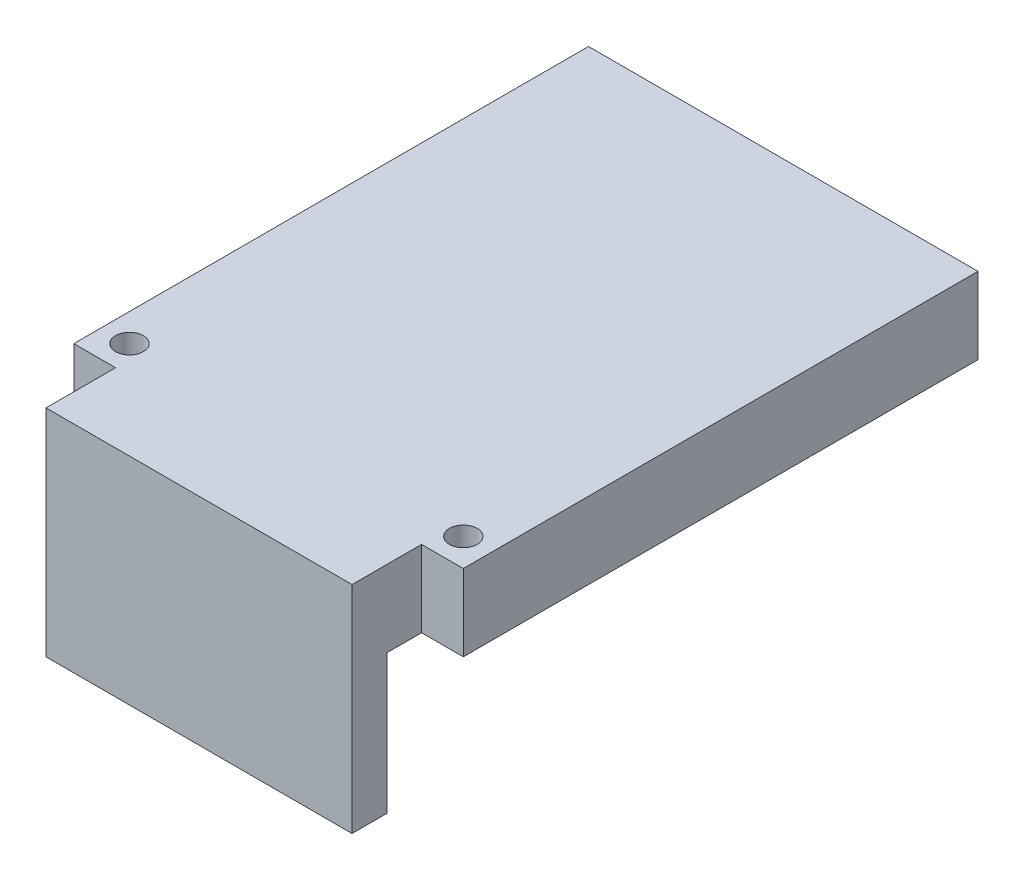
ISO-10303-21;
HEADER;
FILE_DESCRIPTION(('STEP AP214'),'2;1');
FILE_NAME('part.step','',(''),(''),'','','');
FILE_SCHEMA(('AUTOMOTIVE_DESIGN { 1 0 10303 214 1 1 1 1 }'));
ENDSEC;
DATA;
#1=APPLICATION_CONTEXT('core data for automotive mechanical design processes');
#2=APPLICATION_PROTOCOL_DEFINITION('international standard','automotive_design',2000,#1);
#3=PRODUCT_CONTEXT('',#1,'mechanical');
#4=PRODUCT('Part','Part','',(#3));
#5=PRODUCT_RELATED_PRODUCT_CATEGORY('part','',(#4));
#6=PRODUCT_DEFINITION_FORMATION('','',#4);
#7=PRODUCT_DEFINITION_CONTEXT('part definition',#1,'design');
#8=PRODUCT_DEFINITION('design','',#6,#7);
#9=PRODUCT_DEFINITION_SHAPE('','',#8);
#10=(LENGTH_UNIT() NAMED_UNIT(*) SI_UNIT(.MILLI.,.METRE.));
#11=(NAMED_UNIT(*) PLANE_ANGLE_UNIT() SI_UNIT($,.RADIAN.));
#12=(NAMED_UNIT(*) SI_UNIT($,.STERADIAN.) SOLID_ANGLE_UNIT());
#13=UNCERTAINTY_MEASURE_WITH_UNIT(LENGTH_MEASURE(1.E-05),#10,'distance_accuracy_value','');
#14=(GEOMETRIC_REPRESENTATION_CONTEXT(3) GLOBAL_UNCERTAINTY_ASSIGNED_CONTEXT((#13)) GLOBAL_UNIT_ASSIGNED_CONTEXT((#10,
#11,#12)) REPRESENTATION_CONTEXT('',''));
#15=CARTESIAN_POINT('',(0.,0.,0.));
#16=DIRECTION('',(0.,0.,1.));
#17=DIRECTION('',(1.,0.,0.));
#18=AXIS2_PLACEMENT_3D('',#15,#16,#17);
#19=CARTESIAN_POINT('',(0.,5.5,0.));
#20=DIRECTION('',(1.,0.,0.));
#21=DIRECTION('',(0.,0.,-1.));
#22=AXIS2_PLACEMENT_3D('',#19,#20,#21);
#23=PLANE('',#22);
#24=DIRECTION('',(0.,0.,1.));
#25=VECTOR('',#24,1.);
#26=CARTESIAN_POINT('',(0.,0.,0.));
#27=LINE('',#26,#25);
#28=CARTESIAN_POINT('',(0.,0.,-42.));
#29=VERTEX_POINT('',#28);
#30=CARTESIAN_POINT('',(0.,0.,-5.));
#31=VERTEX_POINT('',#30);
#32=EDGE_CURVE('E158',#29,#31,#27,.T.);
#33=ORIENTED_EDGE('',*,*,#32,.T.);
#34=DIRECTION('',(0.,1.,0.));
#35=VECTOR('',#34,1.);
#36=CARTESIAN_POINT('',(0.,0.,-5.));
#37=LINE('',#36,#35);
#38=CARTESIAN_POINT('',(0.,5.5,-5.));
#39=VERTEX_POINT('',#38);
#40=EDGE_CURVE('E155',#31,#39,#37,.T.);
#41=ORIENTED_EDGE('',*,*,#40,.T.);
#42=DIRECTION('',(0.,0.,1.));
#43=VECTOR('',#42,1.);
#44=CARTESIAN_POINT('',(0.,5.5,0.));
#45=LINE('',#44,#43);
#46=CARTESIAN_POINT('',(0.,5.5,-42.));
#47=VERTEX_POINT('',#46);
#48=EDGE_CURVE('E174',#47,#39,#45,.T.);
#49=ORIENTED_EDGE('',*,*,#48,.F.);
#50=DIRECTION('',(0.,-1.,0.));
#51=VECTOR('',#50,1.);
#52=CARTESIAN_POINT('',(0.,5.5,-42.));
#53=LINE('',#52,#51);
#54=EDGE_CURVE('E46',#47,#29,#53,.T.);
#55=ORIENTED_EDGE('',*,*,#54,.T.);
#56=EDGE_LOOP('',(#33,#41,#49,#55));
#57=FACE_BOUND('',#56,.T.);
#58=ADVANCED_FACE('F38',(#57),#23,.F.);
#59=CARTESIAN_POINT('',(0.,5.5,0.));
#60=DIRECTION('',(0.,0.,-1.));
#61=DIRECTION('',(-1.,0.,0.));
#62=AXIS2_PLACEMENT_3D('',#59,#60,#61);
#63=PLANE('',#62);
#64=DIRECTION('',(1.,0.,0.));
#65=VECTOR('',#64,1.);
#66=CARTESIAN_POINT('',(0.,5.5,0.));
#67=LINE('',#66,#65);
#68=CARTESIAN_POINT('',(3.,5.5,0.));
#69=VERTEX_POINT('',#68);
#70=CARTESIAN_POINT('',(25.,5.5,0.));
#71=VERTEX_POINT('',#70);
#72=EDGE_CURVE('E177',#69,#71,#67,.T.);
#73=ORIENTED_EDGE('',*,*,#72,.F.);
#74=DIRECTION('',(0.,1.,0.));
#75=VECTOR('',#74,1.);
#76=CARTESIAN_POINT('',(3.,0.,0.));
#77=LINE('',#76,#75);
#78=CARTESIAN_POINT('',(3.,-10.,0.));
#79=VERTEX_POINT('',#78);
#80=EDGE_CURVE('E150',#79,#69,#77,.T.);
#81=ORIENTED_EDGE('',*,*,#80,.F.);
#82=DIRECTION('',(-1.,0.,0.));
#83=VECTOR('',#82,1.);
#84=CARTESIAN_POINT('',(3.,-10.,0.));
#85=LINE('',#84,#83);
#86=CARTESIAN_POINT('',(25.,-10.,0.));
#87=VERTEX_POINT('',#86);
#88=EDGE_CURVE('E132',#87,#79,#85,.T.);
#89=ORIENTED_EDGE('',*,*,#88,.F.);
#90=DIRECTION('',(0.,1.,0.));
#91=VECTOR('',#90,1.);
#92=CARTESIAN_POINT('',(25.,0.,0.));
#93=LINE('',#92,#91);
#94=EDGE_CURVE('E153',#87,#71,#93,.T.);
#95=ORIENTED_EDGE('',*,*,#94,.T.);
#96=EDGE_LOOP('',(#73,#81,#89,#95));
#97=FACE_BOUND('',#96,.T.);
#98=ADVANCED_FACE('F211',(#97),#63,.F.);
#99=CARTESIAN_POINT('',(28.,5.5,0.));
#100=DIRECTION('',(-1.,0.,0.));
#101=DIRECTION('',(0.,0.,1.));
#102=AXIS2_PLACEMENT_3D('',#99,#100,#101);
#103=PLANE('',#102);
#104=DIRECTION('',(0.,0.,-1.));
#105=VECTOR('',#104,1.);
#106=CARTESIAN_POINT('',(28.,5.5,0.));
#107=LINE('',#106,#105);
#108=CARTESIAN_POINT('',(28.,5.5,-5.));
#109=VERTEX_POINT('',#108);
#110=CARTESIAN_POINT('',(28.,5.5,-42.));
#111=VERTEX_POINT('',#110);
#112=EDGE_CURVE('E181',#109,#111,#107,.T.);
#113=ORIENTED_EDGE('',*,*,#112,.F.);
#114=DIRECTION('',(0.,1.,0.));
#115=VECTOR('',#114,1.);
#116=CARTESIAN_POINT('',(28.,0.,-5.));
#117=LINE('',#116,#115);
#118=CARTESIAN_POINT('',(28.,0.,-5.));
#119=VERTEX_POINT('',#118);
#120=EDGE_CURVE('E166',#119,#109,#117,.T.);
#121=ORIENTED_EDGE('',*,*,#120,.F.);
#122=DIRECTION('',(0.,0.,-1.));
#123=VECTOR('',#122,1.);
#124=CARTESIAN_POINT('',(28.,0.,0.));
#125=LINE('',#124,#123);
#126=CARTESIAN_POINT('',(28.,0.,-42.));
#127=VERTEX_POINT('',#126);
#128=EDGE_CURVE('E187',#119,#127,#125,.T.);
#129=ORIENTED_EDGE('',*,*,#128,.T.);
#130=DIRECTION('',(0.,-1.,0.));
#131=VECTOR('',#130,1.);
#132=CARTESIAN_POINT('',(28.,5.5,-42.));
#133=LINE('',#132,#131);
#134=EDGE_CURVE('E11',#111,#127,#133,.T.);
#135=ORIENTED_EDGE('',*,*,#134,.F.);
#136=EDGE_LOOP('',(#113,#121,#129,#135));
#137=FACE_BOUND('',#136,.T.);
#138=ADVANCED_FACE('F232',(#137),#103,.F.);
#139=CARTESIAN_POINT('',(0.,5.5,-42.));
#140=DIRECTION('',(0.,0.,1.));
#141=DIRECTION('',(1.,0.,0.));
#142=AXIS2_PLACEMENT_3D('',#139,#140,#141);
#143=PLANE('',#142);
#144=DIRECTION('',(-1.,0.,0.));
#145=VECTOR('',#144,1.);
#146=CARTESIAN_POINT('',(0.,0.,-42.));
#147=LINE('',#146,#145);
#148=EDGE_CURVE('E178',#127,#29,#147,.T.);
#149=ORIENTED_EDGE('',*,*,#148,.T.);
#150=ORIENTED_EDGE('',*,*,#54,.F.);
#151=DIRECTION('',(-1.,0.,0.));
#152=VECTOR('',#151,1.);
#153=CARTESIAN_POINT('',(0.,5.5,-42.));
#154=LINE('',#153,#152);
#155=EDGE_CURVE('E183',#111,#47,#154,.T.);
#156=ORIENTED_EDGE('',*,*,#155,.F.);
#157=ORIENTED_EDGE('',*,*,#134,.T.);
#158=EDGE_LOOP('',(#149,#150,#156,#157));
#159=FACE_BOUND('',#158,.T.);
#160=ADVANCED_FACE('F227',(#159),#143,.F.);
#161=CARTESIAN_POINT('',(0.,5.5,0.));
#162=DIRECTION('',(0.,-1.,0.));
#163=DIRECTION('',(0.,0.,-1.));
#164=AXIS2_PLACEMENT_3D('',#161,#162,#163);
#165=PLANE('',#164);
#166=CARTESIAN_POINT('',(2.,5.5,-7.));
#167=DIRECTION('',(0.,1.,0.));
#168=DIRECTION('',(0.,0.,1.));
#169=AXIS2_PLACEMENT_3D('',#166,#167,#168);
#170=CIRCLE('',#169,1.);
#171=CARTESIAN_POINT('',(2.,5.5,-6.));
#172=VERTEX_POINT('',#171);
#173=EDGE_CURVE('E193',#172,#172,#170,.T.);
#174=ORIENTED_EDGE('',*,*,#173,.F.);
#175=EDGE_LOOP('',(#174));
#176=FACE_BOUND('',#175,.T.);
#177=CARTESIAN_POINT('',(26.,5.5,-7.));
#178=DIRECTION('',(0.,1.,0.));
#179=DIRECTION('',(0.,0.,1.));
#180=AXIS2_PLACEMENT_3D('',#177,#178,#179);
#181=CIRCLE('',#180,1.);
#182=CARTESIAN_POINT('',(26.,5.5,-6.));
#183=VERTEX_POINT('',#182);
#184=EDGE_CURVE('E198',#183,#183,#181,.T.);
#185=ORIENTED_EDGE('',*,*,#184,.F.);
#186=EDGE_LOOP('',(#185));
#187=FACE_BOUND('',#186,.T.);
#188=ORIENTED_EDGE('',*,*,#48,.T.);
#189=DIRECTION('',(-1.,0.,0.));
#190=VECTOR('',#189,1.);
#191=CARTESIAN_POINT('',(0.,5.5,-5.));
#192=LINE('',#191,#190);
#193=CARTESIAN_POINT('',(3.,5.5,-5.));
#194=VERTEX_POINT('',#193);
#195=EDGE_CURVE('E148',#194,#39,#192,.T.);
#196=ORIENTED_EDGE('',*,*,#195,.F.);
#197=DIRECTION('',(0.,0.,-1.));
#198=VECTOR('',#197,1.);
#199=CARTESIAN_POINT('',(3.,5.5,0.));
#200=LINE('',#199,#198);
#201=EDGE_CURVE('E151',#69,#194,#200,.T.);
#202=ORIENTED_EDGE('',*,*,#201,.F.);
#203=ORIENTED_EDGE('',*,*,#72,.T.);
#204=DIRECTION('',(0.,0.,1.));
#205=VECTOR('',#204,1.);
#206=CARTESIAN_POINT('',(25.,5.5,0.));
#207=LINE('',#206,#205);
#208=CARTESIAN_POINT('',(25.,5.5,-5.));
#209=VERTEX_POINT('',#208);
#210=EDGE_CURVE('E141',#209,#71,#207,.T.);
#211=ORIENTED_EDGE('',*,*,#210,.F.);
#212=DIRECTION('',(-1.,0.,0.));
#213=VECTOR('',#212,1.);
#214=CARTESIAN_POINT('',(28.,5.5,-5.));
#215=LINE('',#214,#213);
#216=EDGE_CURVE('E138',#109,#209,#215,.T.);
#217=ORIENTED_EDGE('',*,*,#216,.F.);
#218=ORIENTED_EDGE('',*,*,#112,.T.);
#219=ORIENTED_EDGE('',*,*,#155,.T.);
#220=EDGE_LOOP('',(#188,#196,#202,#203,#211,#217,#218,#219));
#221=FACE_BOUND('',#220,.T.);
#222=ADVANCED_FACE('F215',(#176,#187,#221),#165,.F.);
#223=CARTESIAN_POINT('',(0.,0.,0.));
#224=DIRECTION('',(0.,-1.,0.));
#225=DIRECTION('',(0.,0.,-1.));
#226=AXIS2_PLACEMENT_3D('',#223,#224,#225);
#227=PLANE('',#226);
#228=CARTESIAN_POINT('',(2.,0.,-7.));
#229=DIRECTION('',(0.,-1.,0.));
#230=DIRECTION('',(0.,0.,-1.));
#231=AXIS2_PLACEMENT_3D('',#228,#229,#230);
#232=CIRCLE('',#231,1.);
#233=CARTESIAN_POINT('',(2.,0.,-8.));
#234=VERTEX_POINT('',#233);
#235=EDGE_CURVE('E41',#234,#234,#232,.T.);
#236=ORIENTED_EDGE('',*,*,#235,.F.);
#237=EDGE_LOOP('',(#236));
#238=FACE_BOUND('',#237,.T.);
#239=CARTESIAN_POINT('',(26.,0.,-7.));
#240=DIRECTION('',(0.,-1.,0.));
#241=DIRECTION('',(0.,0.,-1.));
#242=AXIS2_PLACEMENT_3D('',#239,#240,#241);
#243=CIRCLE('',#242,1.);
#244=CARTESIAN_POINT('',(26.,0.,-8.));
#245=VERTEX_POINT('',#244);
#246=EDGE_CURVE('E191',#245,#245,#243,.T.);
#247=ORIENTED_EDGE('',*,*,#246,.F.);
#248=EDGE_LOOP('',(#247));
#249=FACE_BOUND('',#248,.T.);
#250=DIRECTION('',(1.,0.,0.));
#251=VECTOR('',#250,1.);
#252=CARTESIAN_POINT('',(3.,0.,-2.5));
#253=LINE('',#252,#251);
#254=CARTESIAN_POINT('',(3.,0.,-2.5));
#255=VERTEX_POINT('',#254);
#256=CARTESIAN_POINT('',(25.,0.,-2.5));
#257=VERTEX_POINT('',#256);
#258=EDGE_CURVE('E54',#255,#257,#253,.T.);
#259=ORIENTED_EDGE('',*,*,#258,.F.);
#260=DIRECTION('',(0.,0.,-1.));
#261=VECTOR('',#260,1.);
#262=CARTESIAN_POINT('',(3.,0.,0.));
#263=LINE('',#262,#261);
#264=CARTESIAN_POINT('',(3.,0.,-5.));
#265=VERTEX_POINT('',#264);
#266=EDGE_CURVE('E58',#255,#265,#263,.T.);
#267=ORIENTED_EDGE('',*,*,#266,.T.);
#268=DIRECTION('',(-1.,0.,0.));
#269=VECTOR('',#268,1.);
#270=CARTESIAN_POINT('',(0.,0.,-5.));
#271=LINE('',#270,#269);
#272=EDGE_CURVE('E147',#265,#31,#271,.T.);
#273=ORIENTED_EDGE('',*,*,#272,.T.);
#274=ORIENTED_EDGE('',*,*,#32,.F.);
#275=ORIENTED_EDGE('',*,*,#148,.F.);
#276=ORIENTED_EDGE('',*,*,#128,.F.);
#277=DIRECTION('',(-1.,0.,0.));
#278=VECTOR('',#277,1.);
#279=CARTESIAN_POINT('',(28.,0.,-5.));
#280=LINE('',#279,#278);
#281=CARTESIAN_POINT('',(25.,0.,-5.));
#282=VERTEX_POINT('',#281);
#283=EDGE_CURVE('E162',#119,#282,#280,.T.);
#284=ORIENTED_EDGE('',*,*,#283,.T.);
#285=DIRECTION('',(0.,0.,1.));
#286=VECTOR('',#285,1.);
#287=CARTESIAN_POINT('',(25.,0.,0.));
#288=LINE('',#287,#286);
#289=EDGE_CURVE('E165',#282,#257,#288,.T.);
#290=ORIENTED_EDGE('',*,*,#289,.T.);
#291=EDGE_LOOP('',(#259,#267,#273,#274,#275,#276,#284,#290));
#292=FACE_BOUND('',#291,.T.);
#293=ADVANCED_FACE('F224',(#238,#249,#292),#227,.T.);
#294=CARTESIAN_POINT('',(25.,0.,0.));
#295=DIRECTION('',(-1.,0.,0.));
#296=DIRECTION('',(0.,0.,1.));
#297=AXIS2_PLACEMENT_3D('',#294,#295,#296);
#298=PLANE('',#297);
#299=ORIENTED_EDGE('',*,*,#210,.T.);
#300=ORIENTED_EDGE('',*,*,#94,.F.);
#301=DIRECTION('',(0.,0.,1.));
#302=VECTOR('',#301,1.);
#303=CARTESIAN_POINT('',(25.,-10.,-2.5));
#304=LINE('',#303,#302);
#305=CARTESIAN_POINT('',(25.,-10.,-2.5));
#306=VERTEX_POINT('',#305);
#307=EDGE_CURVE('E125',#306,#87,#304,.T.);
#308=ORIENTED_EDGE('',*,*,#307,.F.);
#309=DIRECTION('',(0.,1.,0.));
#310=VECTOR('',#309,1.);
#311=CARTESIAN_POINT('',(25.,-10.,-2.5));
#312=LINE('',#311,#310);
#313=EDGE_CURVE('E121',#306,#257,#312,.T.);
#314=ORIENTED_EDGE('',*,*,#313,.T.);
#315=ORIENTED_EDGE('',*,*,#289,.F.);
#316=DIRECTION('',(0.,1.,0.));
#317=VECTOR('',#316,1.);
#318=CARTESIAN_POINT('',(25.,0.,-5.));
#319=LINE('',#318,#317);
#320=EDGE_CURVE('E171',#282,#209,#319,.T.);
#321=ORIENTED_EDGE('',*,*,#320,.T.);
#322=EDGE_LOOP('',(#299,#300,#308,#314,#315,#321));
#323=FACE_BOUND('',#322,.T.);
#324=ADVANCED_FACE('F207',(#323),#298,.F.);
#325=CARTESIAN_POINT('',(28.,0.,-5.));
#326=DIRECTION('',(0.,0.,-1.));
#327=DIRECTION('',(-1.,0.,0.));
#328=AXIS2_PLACEMENT_3D('',#325,#326,#327);
#329=PLANE('',#328);
#330=ORIENTED_EDGE('',*,*,#216,.T.);
#331=ORIENTED_EDGE('',*,*,#320,.F.);
#332=ORIENTED_EDGE('',*,*,#283,.F.);
#333=ORIENTED_EDGE('',*,*,#120,.T.);
#334=EDGE_LOOP('',(#330,#331,#332,#333));
#335=FACE_BOUND('',#334,.T.);
#336=ADVANCED_FACE('F236',(#335),#329,.F.);
#337=CARTESIAN_POINT('',(0.,0.,-5.));
#338=DIRECTION('',(0.,0.,-1.));
#339=DIRECTION('',(-1.,0.,0.));
#340=AXIS2_PLACEMENT_3D('',#337,#338,#339);
#341=PLANE('',#340);
#342=ORIENTED_EDGE('',*,*,#195,.T.);
#343=ORIENTED_EDGE('',*,*,#40,.F.);
#344=ORIENTED_EDGE('',*,*,#272,.F.);
#345=DIRECTION('',(0.,1.,0.));
#346=VECTOR('',#345,1.);
#347=CARTESIAN_POINT('',(3.,0.,-5.));
#348=LINE('',#347,#346);
#349=EDGE_CURVE('E159',#265,#194,#348,.T.);
#350=ORIENTED_EDGE('',*,*,#349,.T.);
#351=EDGE_LOOP('',(#342,#343,#344,#350));
#352=FACE_BOUND('',#351,.T.);
#353=ADVANCED_FACE('F219',(#352),#341,.F.);
#354=CARTESIAN_POINT('',(3.,0.,0.));
#355=DIRECTION('',(1.,0.,0.));
#356=DIRECTION('',(0.,0.,-1.));
#357=AXIS2_PLACEMENT_3D('',#354,#355,#356);
#358=PLANE('',#357);
#359=ORIENTED_EDGE('',*,*,#201,.T.);
#360=ORIENTED_EDGE('',*,*,#349,.F.);
#361=ORIENTED_EDGE('',*,*,#266,.F.);
#362=DIRECTION('',(0.,1.,0.));
#363=VECTOR('',#362,1.);
#364=CARTESIAN_POINT('',(3.,-10.,-2.5));
#365=LINE('',#364,#363);
#366=CARTESIAN_POINT('',(3.,-10.,-2.5));
#367=VERTEX_POINT('',#366);
#368=EDGE_CURVE('E119',#367,#255,#365,.T.);
#369=ORIENTED_EDGE('',*,*,#368,.F.);
#370=DIRECTION('',(0.,0.,-1.));
#371=VECTOR('',#370,1.);
#372=CARTESIAN_POINT('',(3.,-10.,-2.5));
#373=LINE('',#372,#371);
#374=EDGE_CURVE('E126',#79,#367,#373,.T.);
#375=ORIENTED_EDGE('',*,*,#374,.F.);
#376=ORIENTED_EDGE('',*,*,#80,.T.);
#377=EDGE_LOOP('',(#359,#360,#361,#369,#375,#376));
#378=FACE_BOUND('',#377,.T.);
#379=ADVANCED_FACE('F136',(#378),#358,.F.);
#380=CARTESIAN_POINT('',(3.,-10.,-2.5));
#381=DIRECTION('',(0.,0.,1.));
#382=DIRECTION('',(1.,0.,0.));
#383=AXIS2_PLACEMENT_3D('',#380,#381,#382);
#384=PLANE('',#383);
#385=ORIENTED_EDGE('',*,*,#258,.T.);
#386=ORIENTED_EDGE('',*,*,#313,.F.);
#387=DIRECTION('',(1.,0.,0.));
#388=VECTOR('',#387,1.);
#389=CARTESIAN_POINT('',(3.,-10.,-2.5));
#390=LINE('',#389,#388);
#391=EDGE_CURVE('E115',#367,#306,#390,.T.);
#392=ORIENTED_EDGE('',*,*,#391,.F.);
#393=ORIENTED_EDGE('',*,*,#368,.T.);
#394=EDGE_LOOP('',(#385,#386,#392,#393));
#395=FACE_BOUND('',#394,.T.);
#396=ADVANCED_FACE('F117',(#395),#384,.F.);
#397=CARTESIAN_POINT('',(0.,-10.,0.));
#398=DIRECTION('',(0.,1.,0.));
#399=DIRECTION('',(0.,0.,1.));
#400=AXIS2_PLACEMENT_3D('',#397,#398,#399);
#401=PLANE('',#400);
#402=ORIENTED_EDGE('',*,*,#374,.T.);
#403=ORIENTED_EDGE('',*,*,#391,.T.);
#404=ORIENTED_EDGE('',*,*,#307,.T.);
#405=ORIENTED_EDGE('',*,*,#88,.T.);
#406=EDGE_LOOP('',(#402,#403,#404,#405));
#407=FACE_BOUND('',#406,.T.);
#408=ADVANCED_FACE('F130',(#407),#401,.F.);
#409=CARTESIAN_POINT('',(26.,-4.5,-7.));
#410=DIRECTION('',(0.,1.,0.));
#411=DIRECTION('',(0.,0.,1.));
#412=AXIS2_PLACEMENT_3D('',#409,#410,#411);
#413=CYLINDRICAL_SURFACE('',#412,1.);
#414=ORIENTED_EDGE('',*,*,#246,.T.);
#415=EDGE_LOOP('',(#414));
#416=FACE_BOUND('',#415,.T.);
#417=ORIENTED_EDGE('',*,*,#184,.T.);
#418=EDGE_LOOP('',(#417));
#419=FACE_BOUND('',#418,.T.);
#420=ADVANCED_FACE('F267',(#416,#419),#413,.F.);
#421=CARTESIAN_POINT('',(2.,-4.5,-7.));
#422=DIRECTION('',(0.,1.,0.));
#423=DIRECTION('',(0.,0.,1.));
#424=AXIS2_PLACEMENT_3D('',#421,#422,#423);
#425=CYLINDRICAL_SURFACE('',#424,1.);
#426=ORIENTED_EDGE('',*,*,#235,.T.);
#427=EDGE_LOOP('',(#426));
#428=FACE_BOUND('',#427,.T.);
#429=ORIENTED_EDGE('',*,*,#173,.T.);
#430=EDGE_LOOP('',(#429));
#431=FACE_BOUND('',#430,.T.);
#432=ADVANCED_FACE('F269',(#428,#431),#425,.F.);
#433=CLOSED_SHELL('',(#58,#98,#138,#160,#222,#293,#324,#336,#353,#379,#396,#408,#420,#432));
#434=MANIFOLD_SOLID_BREP('B2',#433);
#435=ADVANCED_BREP_SHAPE_REPRESENTATION('',(#18,#434),#14);
#436=SHAPE_DEFINITION_REPRESENTATION(#9,#435);
ENDSEC;
END-ISO-10303-21;
